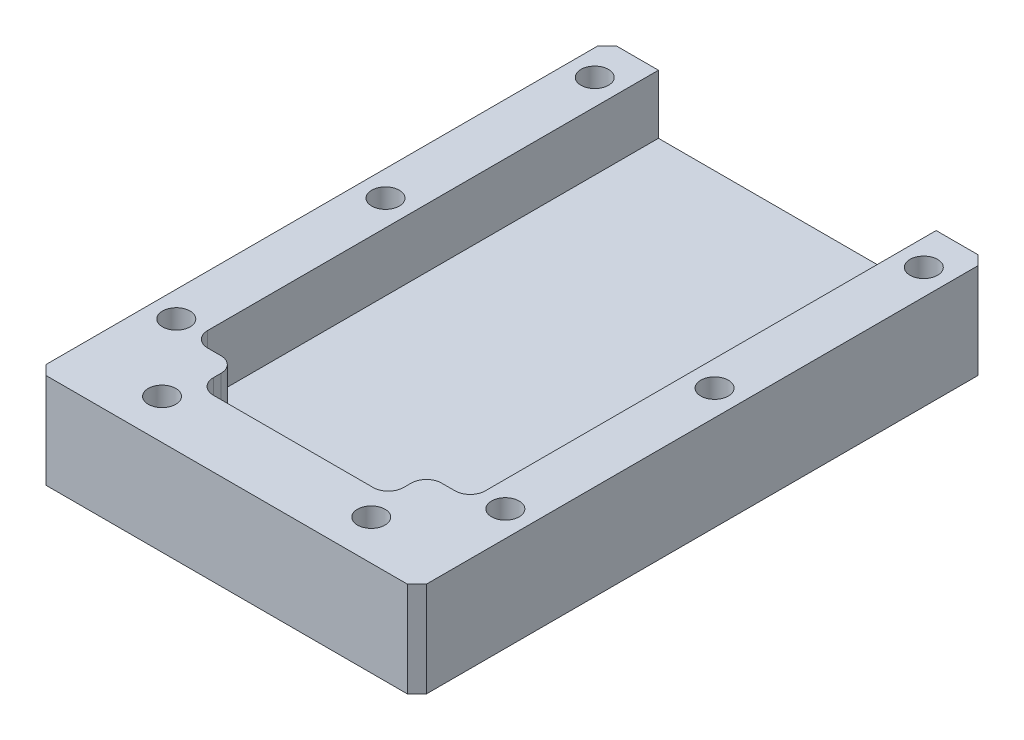
ISO-10303-21;
HEADER;
FILE_DESCRIPTION(('STEP AP214'),'2;1');
FILE_NAME('part.step','',(''),(''),'','','');
FILE_SCHEMA(('AUTOMOTIVE_DESIGN { 1 0 10303 214 1 1 1 1 }'));
ENDSEC;
DATA;
#1=APPLICATION_CONTEXT('core data for automotive mechanical design processes');
#2=APPLICATION_PROTOCOL_DEFINITION('international standard','automotive_design',2000,#1);
#3=PRODUCT_CONTEXT('',#1,'mechanical');
#4=PRODUCT('Part','Part','',(#3));
#5=PRODUCT_RELATED_PRODUCT_CATEGORY('part','',(#4));
#6=PRODUCT_DEFINITION_FORMATION('','',#4);
#7=PRODUCT_DEFINITION_CONTEXT('part definition',#1,'design');
#8=PRODUCT_DEFINITION('design','',#6,#7);
#9=PRODUCT_DEFINITION_SHAPE('','',#8);
#10=(LENGTH_UNIT() NAMED_UNIT(*) SI_UNIT(.MILLI.,.METRE.));
#11=(NAMED_UNIT(*) PLANE_ANGLE_UNIT() SI_UNIT($,.RADIAN.));
#12=(NAMED_UNIT(*) SI_UNIT($,.STERADIAN.) SOLID_ANGLE_UNIT());
#13=UNCERTAINTY_MEASURE_WITH_UNIT(LENGTH_MEASURE(1.E-05),#10,'distance_accuracy_value','');
#14=(GEOMETRIC_REPRESENTATION_CONTEXT(3) GLOBAL_UNCERTAINTY_ASSIGNED_CONTEXT((#13)) GLOBAL_UNIT_ASSIGNED_CONTEXT((#10,
#11,#12)) REPRESENTATION_CONTEXT('',''));
#15=CARTESIAN_POINT('',(0.,0.,0.));
#16=DIRECTION('',(0.,0.,1.));
#17=DIRECTION('',(1.,0.,0.));
#18=AXIS2_PLACEMENT_3D('',#15,#16,#17);
#19=CARTESIAN_POINT('',(-40.,10.,-30.));
#20=DIRECTION('',(1.,0.,0.));
#21=DIRECTION('',(0.,0.,-1.));
#22=AXIS2_PLACEMENT_3D('',#19,#20,#21);
#23=PLANE('',#22);
#24=DIRECTION('',(0.,0.,1.));
#25=VECTOR('',#24,1.);
#26=CARTESIAN_POINT('',(-40.,0.,-30.));
#27=LINE('',#26,#25);
#28=CARTESIAN_POINT('',(-40.,0.,-29.));
#29=VERTEX_POINT('',#28);
#30=CARTESIAN_POINT('',(-40.,0.,29.));
#31=VERTEX_POINT('',#30);
#32=EDGE_CURVE('E338',#29,#31,#27,.T.);
#33=ORIENTED_EDGE('',*,*,#32,.T.);
#34=DIRECTION('',(0.,1.,0.));
#35=VECTOR('',#34,1.);
#36=CARTESIAN_POINT('',(-40.,10.,29.));
#37=LINE('',#36,#35);
#38=CARTESIAN_POINT('',(-40.,10.,29.));
#39=VERTEX_POINT('',#38);
#40=EDGE_CURVE('E11',#31,#39,#37,.T.);
#41=ORIENTED_EDGE('',*,*,#40,.T.);
#42=DIRECTION('',(0.,0.,1.));
#43=VECTOR('',#42,1.);
#44=CARTESIAN_POINT('',(-40.,10.,-30.));
#45=LINE('',#44,#43);
#46=CARTESIAN_POINT('',(-40.,10.,-29.));
#47=VERTEX_POINT('',#46);
#48=EDGE_CURVE('E339',#47,#39,#45,.T.);
#49=ORIENTED_EDGE('',*,*,#48,.F.);
#50=DIRECTION('',(0.,-1.,0.));
#51=VECTOR('',#50,1.);
#52=CARTESIAN_POINT('',(-40.,10.,-29.));
#53=LINE('',#52,#51);
#54=EDGE_CURVE('E59',#47,#29,#53,.T.);
#55=ORIENTED_EDGE('',*,*,#54,.T.);
#56=EDGE_LOOP('',(#33,#41,#49,#55));
#57=FACE_BOUND('',#56,.T.);
#58=ADVANCED_FACE('F49',(#57),#23,.F.);
#59=CARTESIAN_POINT('',(-40.,10.,30.));
#60=DIRECTION('',(0.,0.,-1.));
#61=DIRECTION('',(-1.,0.,0.));
#62=AXIS2_PLACEMENT_3D('',#59,#60,#61);
#63=PLANE('',#62);
#64=DIRECTION('',(1.,0.,0.));
#65=VECTOR('',#64,1.);
#66=CARTESIAN_POINT('',(-40.,0.,30.));
#67=LINE('',#66,#65);
#68=CARTESIAN_POINT('',(-39.,0.,30.));
#69=VERTEX_POINT('',#68);
#70=CARTESIAN_POINT('',(-1.,0.,30.));
#71=VERTEX_POINT('',#70);
#72=EDGE_CURVE('E358',#69,#71,#67,.T.);
#73=ORIENTED_EDGE('',*,*,#72,.T.);
#74=DIRECTION('',(0.,1.,0.));
#75=VECTOR('',#74,1.);
#76=CARTESIAN_POINT('',(-1.,10.,30.));
#77=LINE('',#76,#75);
#78=CARTESIAN_POINT('',(-1.,10.,30.));
#79=VERTEX_POINT('',#78);
#80=EDGE_CURVE('E66',#71,#79,#77,.T.);
#81=ORIENTED_EDGE('',*,*,#80,.T.);
#82=DIRECTION('',(1.,0.,0.));
#83=VECTOR('',#82,1.);
#84=CARTESIAN_POINT('',(-40.,10.,30.));
#85=LINE('',#84,#83);
#86=CARTESIAN_POINT('',(-39.,10.,30.));
#87=VERTEX_POINT('',#86);
#88=EDGE_CURVE('E342',#87,#79,#85,.T.);
#89=ORIENTED_EDGE('',*,*,#88,.F.);
#90=DIRECTION('',(0.,-1.,0.));
#91=VECTOR('',#90,1.);
#92=CARTESIAN_POINT('',(-39.,10.,30.));
#93=LINE('',#92,#91);
#94=EDGE_CURVE('E480',#87,#69,#93,.T.);
#95=ORIENTED_EDGE('',*,*,#94,.T.);
#96=EDGE_LOOP('',(#73,#81,#89,#95));
#97=FACE_BOUND('',#96,.T.);
#98=ADVANCED_FACE('F501',(#97),#63,.F.);
#99=CARTESIAN_POINT('',(0.,10.,-30.));
#100=DIRECTION('',(-1.,0.,0.));
#101=DIRECTION('',(0.,0.,1.));
#102=AXIS2_PLACEMENT_3D('',#99,#100,#101);
#103=PLANE('',#102);
#104=DIRECTION('',(0.,0.,-1.));
#105=VECTOR('',#104,1.);
#106=CARTESIAN_POINT('',(0.,0.,-30.));
#107=LINE('',#106,#105);
#108=CARTESIAN_POINT('',(0.,0.,29.));
#109=VERTEX_POINT('',#108);
#110=CARTESIAN_POINT('',(0.,0.,-29.));
#111=VERTEX_POINT('',#110);
#112=EDGE_CURVE('E361',#109,#111,#107,.T.);
#113=ORIENTED_EDGE('',*,*,#112,.T.);
#114=DIRECTION('',(0.,1.,0.));
#115=VECTOR('',#114,1.);
#116=CARTESIAN_POINT('',(0.,10.,-29.));
#117=LINE('',#116,#115);
#118=CARTESIAN_POINT('',(0.,10.,-29.));
#119=VERTEX_POINT('',#118);
#120=EDGE_CURVE('E466',#111,#119,#117,.T.);
#121=ORIENTED_EDGE('',*,*,#120,.T.);
#122=DIRECTION('',(0.,0.,-1.));
#123=VECTOR('',#122,1.);
#124=CARTESIAN_POINT('',(0.,10.,-30.));
#125=LINE('',#124,#123);
#126=CARTESIAN_POINT('',(0.,10.,29.));
#127=VERTEX_POINT('',#126);
#128=EDGE_CURVE('E346',#127,#119,#125,.T.);
#129=ORIENTED_EDGE('',*,*,#128,.F.);
#130=DIRECTION('',(0.,-1.,0.));
#131=VECTOR('',#130,1.);
#132=CARTESIAN_POINT('',(0.,10.,29.));
#133=LINE('',#132,#131);
#134=EDGE_CURVE('E462',#127,#109,#133,.T.);
#135=ORIENTED_EDGE('',*,*,#134,.T.);
#136=EDGE_LOOP('',(#113,#121,#129,#135));
#137=FACE_BOUND('',#136,.T.);
#138=ADVANCED_FACE('F511',(#137),#103,.F.);
#139=CARTESIAN_POINT('',(-40.,10.,-30.));
#140=DIRECTION('',(0.,0.,1.));
#141=DIRECTION('',(1.,0.,0.));
#142=AXIS2_PLACEMENT_3D('',#139,#140,#141);
#143=PLANE('',#142);
#144=DIRECTION('',(-1.,0.,0.));
#145=VECTOR('',#144,1.);
#146=CARTESIAN_POINT('',(-40.,10.,-30.));
#147=LINE('',#146,#145);
#148=CARTESIAN_POINT('',(-1.,10.,-30.));
#149=VERTEX_POINT('',#148);
#150=CARTESIAN_POINT('',(-5.4,10.,-30.));
#151=VERTEX_POINT('',#150);
#152=EDGE_CURVE('E351',#149,#151,#147,.T.);
#153=ORIENTED_EDGE('',*,*,#152,.F.);
#154=DIRECTION('',(0.,-1.,0.));
#155=VECTOR('',#154,1.);
#156=CARTESIAN_POINT('',(-1.,10.,-30.));
#157=LINE('',#156,#155);
#158=CARTESIAN_POINT('',(-1.,0.,-30.));
#159=VERTEX_POINT('',#158);
#160=EDGE_CURVE('E446',#149,#159,#157,.T.);
#161=ORIENTED_EDGE('',*,*,#160,.T.);
#162=DIRECTION('',(-1.,0.,0.));
#163=VECTOR('',#162,1.);
#164=CARTESIAN_POINT('',(-40.,0.,-30.));
#165=LINE('',#164,#163);
#166=CARTESIAN_POINT('',(-39.,0.,-30.));
#167=VERTEX_POINT('',#166);
#168=EDGE_CURVE('E343',#159,#167,#165,.T.);
#169=ORIENTED_EDGE('',*,*,#168,.T.);
#170=DIRECTION('',(0.,1.,0.));
#171=VECTOR('',#170,1.);
#172=CARTESIAN_POINT('',(-39.,10.,-30.));
#173=LINE('',#172,#171);
#174=CARTESIAN_POINT('',(-39.,10.,-30.));
#175=VERTEX_POINT('',#174);
#176=EDGE_CURVE('E443',#167,#175,#173,.T.);
#177=ORIENTED_EDGE('',*,*,#176,.T.);
#178=CARTESIAN_POINT('',(-34.6,10.,-30.));
#179=VERTEX_POINT('',#178);
#180=EDGE_CURVE('E350',#179,#175,#147,.T.);
#181=ORIENTED_EDGE('',*,*,#180,.F.);
#182=DIRECTION('',(0.,1.,0.));
#183=VECTOR('',#182,1.);
#184=CARTESIAN_POINT('',(-34.6,3.8,-30.));
#185=LINE('',#184,#183);
#186=CARTESIAN_POINT('',(-34.6,3.8,-30.));
#187=VERTEX_POINT('',#186);
#188=EDGE_CURVE('E226',#187,#179,#185,.T.);
#189=ORIENTED_EDGE('',*,*,#188,.F.);
#190=DIRECTION('',(-1.,0.,0.));
#191=VECTOR('',#190,1.);
#192=CARTESIAN_POINT('',(-5.4,3.8,-30.));
#193=LINE('',#192,#191);
#194=CARTESIAN_POINT('',(-5.4,3.8,-30.));
#195=VERTEX_POINT('',#194);
#196=EDGE_CURVE('E206',#195,#187,#193,.T.);
#197=ORIENTED_EDGE('',*,*,#196,.F.);
#198=DIRECTION('',(0.,1.,0.));
#199=VECTOR('',#198,1.);
#200=CARTESIAN_POINT('',(-5.4,3.8,-30.));
#201=LINE('',#200,#199);
#202=EDGE_CURVE('E219',#195,#151,#201,.T.);
#203=ORIENTED_EDGE('',*,*,#202,.T.);
#204=EDGE_LOOP('',(#153,#161,#169,#177,#181,#189,#197,#203));
#205=FACE_BOUND('',#204,.T.);
#206=ADVANCED_FACE('F229',(#205),#143,.F.);
#207=CARTESIAN_POINT('',(0.,10.,0.));
#208=DIRECTION('',(0.,1.,0.));
#209=DIRECTION('',(0.,0.,1.));
#210=AXIS2_PLACEMENT_3D('',#207,#208,#209);
#211=PLANE('',#210);
#212=ORIENTED_EDGE('',*,*,#128,.T.);
#213=DIRECTION('',(0.707106781186543,0.,0.707106781186552));
#214=VECTOR('',#213,1.);
#215=CARTESIAN_POINT('',(14.5,10.,-14.4999999999998));
#216=LINE('',#215,#214);
#217=EDGE_CURVE('E477',#119,#149,#216,.F.);
#218=ORIENTED_EDGE('',*,*,#217,.T.);
#219=ORIENTED_EDGE('',*,*,#152,.T.);
#220=DIRECTION('',(0.,0.,-1.));
#221=VECTOR('',#220,1.);
#222=CARTESIAN_POINT('',(-5.4,10.,19.));
#223=LINE('',#222,#221);
#224=CARTESIAN_POINT('',(-5.4,10.,17.4));
#225=VERTEX_POINT('',#224);
#226=EDGE_CURVE('E222',#225,#151,#223,.T.);
#227=ORIENTED_EDGE('',*,*,#226,.F.);
#228=CARTESIAN_POINT('',(-7.,10.,17.4));
#229=DIRECTION('',(0.,1.,0.));
#230=DIRECTION('',(0.,0.,1.));
#231=AXIS2_PLACEMENT_3D('',#228,#229,#230);
#232=CIRCLE('',#231,1.6);
#233=CARTESIAN_POINT('',(-7.,10.,19.));
#234=VERTEX_POINT('',#233);
#235=EDGE_CURVE('E431',#225,#234,#232,.F.);
#236=ORIENTED_EDGE('',*,*,#235,.T.);
#237=DIRECTION('',(1.,0.,0.));
#238=VECTOR('',#237,1.);
#239=CARTESIAN_POINT('',(-10.,10.,19.));
#240=LINE('',#239,#238);
#241=CARTESIAN_POINT('',(-8.4,10.,19.));
#242=VERTEX_POINT('',#241);
#243=EDGE_CURVE('E253',#242,#234,#240,.T.);
#244=ORIENTED_EDGE('',*,*,#243,.F.);
#245=CARTESIAN_POINT('',(-8.4,10.,20.6));
#246=DIRECTION('',(0.,1.,0.));
#247=DIRECTION('',(0.,0.,1.));
#248=AXIS2_PLACEMENT_3D('',#245,#246,#247);
#249=CIRCLE('',#248,1.6);
#250=CARTESIAN_POINT('',(-10.,10.,20.6));
#251=VERTEX_POINT('',#250);
#252=EDGE_CURVE('E374',#242,#251,#249,.T.);
#253=ORIENTED_EDGE('',*,*,#252,.T.);
#254=DIRECTION('',(0.,0.,-1.));
#255=VECTOR('',#254,1.);
#256=CARTESIAN_POINT('',(-10.,10.,23.));
#257=LINE('',#256,#255);
#258=CARTESIAN_POINT('',(-10.,10.,21.4));
#259=VERTEX_POINT('',#258);
#260=EDGE_CURVE('E249',#259,#251,#257,.T.);
#261=ORIENTED_EDGE('',*,*,#260,.F.);
#262=CARTESIAN_POINT('',(-11.6,10.,21.4));
#263=DIRECTION('',(0.,1.,0.));
#264=DIRECTION('',(0.,0.,1.));
#265=AXIS2_PLACEMENT_3D('',#262,#263,#264);
#266=CIRCLE('',#265,1.6);
#267=CARTESIAN_POINT('',(-11.6,10.,23.));
#268=VERTEX_POINT('',#267);
#269=EDGE_CURVE('E437',#259,#268,#266,.F.);
#270=ORIENTED_EDGE('',*,*,#269,.T.);
#271=DIRECTION('',(1.,0.,0.));
#272=VECTOR('',#271,1.);
#273=CARTESIAN_POINT('',(-30.,10.,23.));
#274=LINE('',#273,#272);
#275=CARTESIAN_POINT('',(-28.4,10.,23.));
#276=VERTEX_POINT('',#275);
#277=EDGE_CURVE('E245',#276,#268,#274,.T.);
#278=ORIENTED_EDGE('',*,*,#277,.F.);
#279=CARTESIAN_POINT('',(-28.4,10.,21.4));
#280=DIRECTION('',(0.,1.,0.));
#281=DIRECTION('',(0.,0.,1.));
#282=AXIS2_PLACEMENT_3D('',#279,#280,#281);
#283=CIRCLE('',#282,1.6);
#284=CARTESIAN_POINT('',(-30.,10.,21.4));
#285=VERTEX_POINT('',#284);
#286=EDGE_CURVE('E440',#276,#285,#283,.F.);
#287=ORIENTED_EDGE('',*,*,#286,.T.);
#288=DIRECTION('',(0.,0.,1.));
#289=VECTOR('',#288,1.);
#290=CARTESIAN_POINT('',(-30.,10.,19.));
#291=LINE('',#290,#289);
#292=CARTESIAN_POINT('',(-30.,10.,20.6));
#293=VERTEX_POINT('',#292);
#294=EDGE_CURVE('E267',#293,#285,#291,.T.);
#295=ORIENTED_EDGE('',*,*,#294,.F.);
#296=CARTESIAN_POINT('',(-31.6,10.,20.6));
#297=DIRECTION('',(0.,1.,0.));
#298=DIRECTION('',(0.,0.,1.));
#299=AXIS2_PLACEMENT_3D('',#296,#297,#298);
#300=CIRCLE('',#299,1.6);
#301=CARTESIAN_POINT('',(-31.6,10.,19.));
#302=VERTEX_POINT('',#301);
#303=EDGE_CURVE('E377',#293,#302,#300,.T.);
#304=ORIENTED_EDGE('',*,*,#303,.T.);
#305=DIRECTION('',(1.,0.,0.));
#306=VECTOR('',#305,1.);
#307=CARTESIAN_POINT('',(-34.6,10.,19.));
#308=LINE('',#307,#306);
#309=CARTESIAN_POINT('',(-33.,10.,19.));
#310=VERTEX_POINT('',#309);
#311=EDGE_CURVE('E263',#310,#302,#308,.T.);
#312=ORIENTED_EDGE('',*,*,#311,.F.);
#313=CARTESIAN_POINT('',(-33.,10.,17.4));
#314=DIRECTION('',(0.,1.,0.));
#315=DIRECTION('',(0.,0.,1.));
#316=AXIS2_PLACEMENT_3D('',#313,#314,#315);
#317=CIRCLE('',#316,1.6);
#318=CARTESIAN_POINT('',(-34.6,10.,17.4));
#319=VERTEX_POINT('',#318);
#320=EDGE_CURVE('E428',#310,#319,#317,.F.);
#321=ORIENTED_EDGE('',*,*,#320,.T.);
#322=DIRECTION('',(0.,0.,1.));
#323=VECTOR('',#322,1.);
#324=CARTESIAN_POINT('',(-34.6,10.,-30.));
#325=LINE('',#324,#323);
#326=EDGE_CURVE('E259',#179,#319,#325,.T.);
#327=ORIENTED_EDGE('',*,*,#326,.F.);
#328=ORIENTED_EDGE('',*,*,#180,.T.);
#329=DIRECTION('',(0.70710678118655,0.,-0.707106781186545));
#330=VECTOR('',#329,1.);
#331=CARTESIAN_POINT('',(-34.4999999999999,10.,-34.5000000000001));
#332=LINE('',#331,#330);
#333=EDGE_CURVE('E469',#175,#47,#332,.F.);
#334=ORIENTED_EDGE('',*,*,#333,.T.);
#335=ORIENTED_EDGE('',*,*,#48,.T.);
#336=DIRECTION('',(-0.707106781186543,0.,-0.707106781186552));
#337=VECTOR('',#336,1.);
#338=CARTESIAN_POINT('',(-34.5000000000003,10.,34.4999999999998));
#339=LINE('',#338,#337);
#340=EDGE_CURVE('E73',#39,#87,#339,.F.);
#341=ORIENTED_EDGE('',*,*,#340,.T.);
#342=ORIENTED_EDGE('',*,*,#88,.T.);
#343=DIRECTION('',(-0.70710678118655,0.,0.707106781186545));
#344=VECTOR('',#343,1.);
#345=CARTESIAN_POINT('',(14.5,10.,14.5000000000001));
#346=LINE('',#345,#344);
#347=EDGE_CURVE('E474',#79,#127,#346,.F.);
#348=ORIENTED_EDGE('',*,*,#347,.T.);
#349=EDGE_LOOP('',(#212,#218,#219,#227,#236,#244,#253,#261,#270,#278,#287,#295,#304,#312,#321,
#327,#328,#334,#335,#341,#342,#348));
#350=FACE_BOUND('',#349,.T.);
#351=CARTESIAN_POINT('',(-37.3,10.,-26.));
#352=DIRECTION('',(0.,1.,0.));
#353=DIRECTION('',(0.,0.,1.));
#354=AXIS2_PLACEMENT_3D('',#351,#352,#353);
#355=CIRCLE('',#354,1.45);
#356=CARTESIAN_POINT('',(-37.3,10.,-24.55));
#357=VERTEX_POINT('',#356);
#358=EDGE_CURVE('E273',#357,#357,#355,.T.);
#359=ORIENTED_EDGE('',*,*,#358,.F.);
#360=EDGE_LOOP('',(#359));
#361=FACE_BOUND('',#360,.T.);
#362=CARTESIAN_POINT('',(-37.3,10.,-4.));
#363=DIRECTION('',(0.,1.,0.));
#364=DIRECTION('',(0.,0.,1.));
#365=AXIS2_PLACEMENT_3D('',#362,#363,#364);
#366=CIRCLE('',#365,1.45);
#367=CARTESIAN_POINT('',(-37.3,10.,-2.55));
#368=VERTEX_POINT('',#367);
#369=EDGE_CURVE('E282',#368,#368,#366,.T.);
#370=ORIENTED_EDGE('',*,*,#369,.F.);
#371=EDGE_LOOP('',(#370));
#372=FACE_BOUND('',#371,.T.);
#373=CARTESIAN_POINT('',(-37.3,10.,18.));
#374=DIRECTION('',(0.,1.,0.));
#375=DIRECTION('',(0.,0.,1.));
#376=AXIS2_PLACEMENT_3D('',#373,#374,#375);
#377=CIRCLE('',#376,1.45);
#378=CARTESIAN_POINT('',(-37.3,10.,19.45));
#379=VERTEX_POINT('',#378);
#380=EDGE_CURVE('E290',#379,#379,#377,.T.);
#381=ORIENTED_EDGE('',*,*,#380,.F.);
#382=EDGE_LOOP('',(#381));
#383=FACE_BOUND('',#382,.T.);
#384=CARTESIAN_POINT('',(-31.,10.,25.8));
#385=DIRECTION('',(0.,1.,0.));
#386=DIRECTION('',(0.,0.,1.));
#387=AXIS2_PLACEMENT_3D('',#384,#385,#386);
#388=CIRCLE('',#387,1.45);
#389=CARTESIAN_POINT('',(-31.,10.,27.25));
#390=VERTEX_POINT('',#389);
#391=EDGE_CURVE('E298',#390,#390,#388,.T.);
#392=ORIENTED_EDGE('',*,*,#391,.F.);
#393=EDGE_LOOP('',(#392));
#394=FACE_BOUND('',#393,.T.);
#395=CARTESIAN_POINT('',(-9.,10.,25.8));
#396=DIRECTION('',(0.,1.,0.));
#397=DIRECTION('',(0.,0.,1.));
#398=AXIS2_PLACEMENT_3D('',#395,#396,#397);
#399=CIRCLE('',#398,1.45);
#400=CARTESIAN_POINT('',(-9.,10.,27.25));
#401=VERTEX_POINT('',#400);
#402=EDGE_CURVE('E306',#401,#401,#399,.T.);
#403=ORIENTED_EDGE('',*,*,#402,.F.);
#404=EDGE_LOOP('',(#403));
#405=FACE_BOUND('',#404,.T.);
#406=CARTESIAN_POINT('',(-2.7,10.,18.));
#407=DIRECTION('',(0.,1.,0.));
#408=DIRECTION('',(0.,0.,1.));
#409=AXIS2_PLACEMENT_3D('',#406,#407,#408);
#410=CIRCLE('',#409,1.45);
#411=CARTESIAN_POINT('',(-2.7,10.,19.45));
#412=VERTEX_POINT('',#411);
#413=EDGE_CURVE('E314',#412,#412,#410,.T.);
#414=ORIENTED_EDGE('',*,*,#413,.F.);
#415=EDGE_LOOP('',(#414));
#416=FACE_BOUND('',#415,.T.);
#417=CARTESIAN_POINT('',(-2.7,10.,-4.));
#418=DIRECTION('',(0.,1.,0.));
#419=DIRECTION('',(0.,0.,1.));
#420=AXIS2_PLACEMENT_3D('',#417,#418,#419);
#421=CIRCLE('',#420,1.45);
#422=CARTESIAN_POINT('',(-2.7,10.,-2.55));
#423=VERTEX_POINT('',#422);
#424=EDGE_CURVE('E322',#423,#423,#421,.T.);
#425=ORIENTED_EDGE('',*,*,#424,.F.);
#426=EDGE_LOOP('',(#425));
#427=FACE_BOUND('',#426,.T.);
#428=CARTESIAN_POINT('',(-2.7,10.,-26.));
#429=DIRECTION('',(0.,1.,0.));
#430=DIRECTION('',(0.,0.,1.));
#431=AXIS2_PLACEMENT_3D('',#428,#429,#430);
#432=CIRCLE('',#431,1.45);
#433=CARTESIAN_POINT('',(-2.7,10.,-24.55));
#434=VERTEX_POINT('',#433);
#435=EDGE_CURVE('E330',#434,#434,#432,.T.);
#436=ORIENTED_EDGE('',*,*,#435,.F.);
#437=EDGE_LOOP('',(#436));
#438=FACE_BOUND('',#437,.T.);
#439=ADVANCED_FACE('F503',(#350,#361,#372,#383,#394,#405,#416,#427,#438),#211,.T.);
#440=CARTESIAN_POINT('',(0.,0.,0.));
#441=DIRECTION('',(0.,1.,0.));
#442=DIRECTION('',(0.,0.,1.));
#443=AXIS2_PLACEMENT_3D('',#440,#441,#442);
#444=PLANE('',#443);
#445=CARTESIAN_POINT('',(-37.3,0.,-26.));
#446=DIRECTION('',(0.,1.,0.));
#447=DIRECTION('',(0.,0.,1.));
#448=AXIS2_PLACEMENT_3D('',#445,#446,#447);
#449=CIRCLE('',#448,1.45);
#450=CARTESIAN_POINT('',(-37.3,0.,-24.55));
#451=VERTEX_POINT('',#450);
#452=EDGE_CURVE('E278',#451,#451,#449,.T.);
#453=ORIENTED_EDGE('',*,*,#452,.T.);
#454=EDGE_LOOP('',(#453));
#455=FACE_BOUND('',#454,.T.);
#456=CARTESIAN_POINT('',(-37.3,0.,-4.));
#457=DIRECTION('',(0.,1.,0.));
#458=DIRECTION('',(0.,0.,1.));
#459=AXIS2_PLACEMENT_3D('',#456,#457,#458);
#460=CIRCLE('',#459,1.45);
#461=CARTESIAN_POINT('',(-37.3,0.,-2.55));
#462=VERTEX_POINT('',#461);
#463=EDGE_CURVE('E286',#462,#462,#460,.T.);
#464=ORIENTED_EDGE('',*,*,#463,.T.);
#465=EDGE_LOOP('',(#464));
#466=FACE_BOUND('',#465,.T.);
#467=CARTESIAN_POINT('',(-37.3,0.,18.));
#468=DIRECTION('',(0.,1.,0.));
#469=DIRECTION('',(0.,0.,1.));
#470=AXIS2_PLACEMENT_3D('',#467,#468,#469);
#471=CIRCLE('',#470,1.45);
#472=CARTESIAN_POINT('',(-37.3,0.,19.45));
#473=VERTEX_POINT('',#472);
#474=EDGE_CURVE('E294',#473,#473,#471,.T.);
#475=ORIENTED_EDGE('',*,*,#474,.T.);
#476=EDGE_LOOP('',(#475));
#477=FACE_BOUND('',#476,.T.);
#478=CARTESIAN_POINT('',(-31.,0.,25.8));
#479=DIRECTION('',(0.,1.,0.));
#480=DIRECTION('',(0.,0.,1.));
#481=AXIS2_PLACEMENT_3D('',#478,#479,#480);
#482=CIRCLE('',#481,1.45);
#483=CARTESIAN_POINT('',(-31.,0.,27.25));
#484=VERTEX_POINT('',#483);
#485=EDGE_CURVE('E302',#484,#484,#482,.T.);
#486=ORIENTED_EDGE('',*,*,#485,.T.);
#487=EDGE_LOOP('',(#486));
#488=FACE_BOUND('',#487,.T.);
#489=CARTESIAN_POINT('',(-9.,0.,25.8));
#490=DIRECTION('',(0.,1.,0.));
#491=DIRECTION('',(0.,0.,1.));
#492=AXIS2_PLACEMENT_3D('',#489,#490,#491);
#493=CIRCLE('',#492,1.45);
#494=CARTESIAN_POINT('',(-9.,0.,27.25));
#495=VERTEX_POINT('',#494);
#496=EDGE_CURVE('E310',#495,#495,#493,.T.);
#497=ORIENTED_EDGE('',*,*,#496,.T.);
#498=EDGE_LOOP('',(#497));
#499=FACE_BOUND('',#498,.T.);
#500=CARTESIAN_POINT('',(-2.7,0.,18.));
#501=DIRECTION('',(0.,1.,0.));
#502=DIRECTION('',(0.,0.,1.));
#503=AXIS2_PLACEMENT_3D('',#500,#501,#502);
#504=CIRCLE('',#503,1.45);
#505=CARTESIAN_POINT('',(-2.7,0.,19.45));
#506=VERTEX_POINT('',#505);
#507=EDGE_CURVE('E318',#506,#506,#504,.T.);
#508=ORIENTED_EDGE('',*,*,#507,.T.);
#509=EDGE_LOOP('',(#508));
#510=FACE_BOUND('',#509,.T.);
#511=CARTESIAN_POINT('',(-2.7,0.,-4.));
#512=DIRECTION('',(0.,1.,0.));
#513=DIRECTION('',(0.,0.,1.));
#514=AXIS2_PLACEMENT_3D('',#511,#512,#513);
#515=CIRCLE('',#514,1.45);
#516=CARTESIAN_POINT('',(-2.7,0.,-2.55));
#517=VERTEX_POINT('',#516);
#518=EDGE_CURVE('E326',#517,#517,#515,.T.);
#519=ORIENTED_EDGE('',*,*,#518,.T.);
#520=EDGE_LOOP('',(#519));
#521=FACE_BOUND('',#520,.T.);
#522=CARTESIAN_POINT('',(-2.7,0.,-26.));
#523=DIRECTION('',(0.,1.,0.));
#524=DIRECTION('',(0.,0.,1.));
#525=AXIS2_PLACEMENT_3D('',#522,#523,#524);
#526=CIRCLE('',#525,1.45);
#527=CARTESIAN_POINT('',(-2.7,0.,-24.55));
#528=VERTEX_POINT('',#527);
#529=EDGE_CURVE('E334',#528,#528,#526,.T.);
#530=ORIENTED_EDGE('',*,*,#529,.T.);
#531=EDGE_LOOP('',(#530));
#532=FACE_BOUND('',#531,.T.);
#533=ORIENTED_EDGE('',*,*,#168,.F.);
#534=DIRECTION('',(-0.707106781186543,0.,-0.707106781186552));
#535=VECTOR('',#534,1.);
#536=CARTESIAN_POINT('',(-1.,0.,-30.));
#537=LINE('',#536,#535);
#538=EDGE_CURVE('E459',#159,#111,#537,.F.);
#539=ORIENTED_EDGE('',*,*,#538,.T.);
#540=ORIENTED_EDGE('',*,*,#112,.F.);
#541=DIRECTION('',(0.70710678118655,0.,-0.707106781186545));
#542=VECTOR('',#541,1.);
#543=CARTESIAN_POINT('',(0.,0.,29.));
#544=LINE('',#543,#542);
#545=EDGE_CURVE('E456',#109,#71,#544,.F.);
#546=ORIENTED_EDGE('',*,*,#545,.T.);
#547=ORIENTED_EDGE('',*,*,#72,.F.);
#548=DIRECTION('',(0.707106781186543,0.,0.707106781186552));
#549=VECTOR('',#548,1.);
#550=CARTESIAN_POINT('',(-39.,0.,30.));
#551=LINE('',#550,#549);
#552=EDGE_CURVE('E453',#69,#31,#551,.F.);
#553=ORIENTED_EDGE('',*,*,#552,.T.);
#554=ORIENTED_EDGE('',*,*,#32,.F.);
#555=DIRECTION('',(-0.70710678118655,0.,0.707106781186545));
#556=VECTOR('',#555,1.);
#557=CARTESIAN_POINT('',(-40.,0.,-29.));
#558=LINE('',#557,#556);
#559=EDGE_CURVE('E450',#29,#167,#558,.F.);
#560=ORIENTED_EDGE('',*,*,#559,.T.);
#561=EDGE_LOOP('',(#533,#539,#540,#546,#547,#553,#554,#560));
#562=FACE_BOUND('',#561,.T.);
#563=ADVANCED_FACE('F496',(#455,#466,#477,#488,#499,#510,#521,#532,#562),#444,.F.);
#564=CARTESIAN_POINT('',(-2.7,10.,-26.));
#565=DIRECTION('',(0.,1.,0.));
#566=DIRECTION('',(0.,0.,1.));
#567=AXIS2_PLACEMENT_3D('',#564,#565,#566);
#568=CYLINDRICAL_SURFACE('',#567,1.45);
#569=ORIENTED_EDGE('',*,*,#529,.F.);
#570=EDGE_LOOP('',(#569));
#571=FACE_BOUND('',#570,.T.);
#572=ORIENTED_EDGE('',*,*,#435,.T.);
#573=EDGE_LOOP('',(#572));
#574=FACE_BOUND('',#573,.T.);
#575=ADVANCED_FACE('F644',(#571,#574),#568,.F.);
#576=CARTESIAN_POINT('',(-2.7,10.,-4.));
#577=DIRECTION('',(0.,1.,0.));
#578=DIRECTION('',(0.,0.,1.));
#579=AXIS2_PLACEMENT_3D('',#576,#577,#578);
#580=CYLINDRICAL_SURFACE('',#579,1.45);
#581=ORIENTED_EDGE('',*,*,#518,.F.);
#582=EDGE_LOOP('',(#581));
#583=FACE_BOUND('',#582,.T.);
#584=ORIENTED_EDGE('',*,*,#424,.T.);
#585=EDGE_LOOP('',(#584));
#586=FACE_BOUND('',#585,.T.);
#587=ADVANCED_FACE('F640',(#583,#586),#580,.F.);
#588=CARTESIAN_POINT('',(-2.7,10.,18.));
#589=DIRECTION('',(0.,1.,0.));
#590=DIRECTION('',(0.,0.,1.));
#591=AXIS2_PLACEMENT_3D('',#588,#589,#590);
#592=CYLINDRICAL_SURFACE('',#591,1.45);
#593=ORIENTED_EDGE('',*,*,#507,.F.);
#594=EDGE_LOOP('',(#593));
#595=FACE_BOUND('',#594,.T.);
#596=ORIENTED_EDGE('',*,*,#413,.T.);
#597=EDGE_LOOP('',(#596));
#598=FACE_BOUND('',#597,.T.);
#599=ADVANCED_FACE('F636',(#595,#598),#592,.F.);
#600=CARTESIAN_POINT('',(-9.,10.,25.8));
#601=DIRECTION('',(0.,1.,0.));
#602=DIRECTION('',(0.,0.,1.));
#603=AXIS2_PLACEMENT_3D('',#600,#601,#602);
#604=CYLINDRICAL_SURFACE('',#603,1.45);
#605=ORIENTED_EDGE('',*,*,#496,.F.);
#606=EDGE_LOOP('',(#605));
#607=FACE_BOUND('',#606,.T.);
#608=ORIENTED_EDGE('',*,*,#402,.T.);
#609=EDGE_LOOP('',(#608));
#610=FACE_BOUND('',#609,.T.);
#611=ADVANCED_FACE('F632',(#607,#610),#604,.F.);
#612=CARTESIAN_POINT('',(-31.,10.,25.8));
#613=DIRECTION('',(0.,1.,0.));
#614=DIRECTION('',(0.,0.,1.));
#615=AXIS2_PLACEMENT_3D('',#612,#613,#614);
#616=CYLINDRICAL_SURFACE('',#615,1.45);
#617=ORIENTED_EDGE('',*,*,#485,.F.);
#618=EDGE_LOOP('',(#617));
#619=FACE_BOUND('',#618,.T.);
#620=ORIENTED_EDGE('',*,*,#391,.T.);
#621=EDGE_LOOP('',(#620));
#622=FACE_BOUND('',#621,.T.);
#623=ADVANCED_FACE('F628',(#619,#622),#616,.F.);
#624=CARTESIAN_POINT('',(-37.3,10.,18.));
#625=DIRECTION('',(0.,1.,0.));
#626=DIRECTION('',(0.,0.,1.));
#627=AXIS2_PLACEMENT_3D('',#624,#625,#626);
#628=CYLINDRICAL_SURFACE('',#627,1.45);
#629=ORIENTED_EDGE('',*,*,#474,.F.);
#630=EDGE_LOOP('',(#629));
#631=FACE_BOUND('',#630,.T.);
#632=ORIENTED_EDGE('',*,*,#380,.T.);
#633=EDGE_LOOP('',(#632));
#634=FACE_BOUND('',#633,.T.);
#635=ADVANCED_FACE('F624',(#631,#634),#628,.F.);
#636=CARTESIAN_POINT('',(-37.3,10.,-4.));
#637=DIRECTION('',(0.,1.,0.));
#638=DIRECTION('',(0.,0.,1.));
#639=AXIS2_PLACEMENT_3D('',#636,#637,#638);
#640=CYLINDRICAL_SURFACE('',#639,1.45);
#641=ORIENTED_EDGE('',*,*,#463,.F.);
#642=EDGE_LOOP('',(#641));
#643=FACE_BOUND('',#642,.T.);
#644=ORIENTED_EDGE('',*,*,#369,.T.);
#645=EDGE_LOOP('',(#644));
#646=FACE_BOUND('',#645,.T.);
#647=ADVANCED_FACE('F620',(#643,#646),#640,.F.);
#648=CARTESIAN_POINT('',(-37.3,10.,-26.));
#649=DIRECTION('',(0.,1.,0.));
#650=DIRECTION('',(0.,0.,1.));
#651=AXIS2_PLACEMENT_3D('',#648,#649,#650);
#652=CYLINDRICAL_SURFACE('',#651,1.45);
#653=ORIENTED_EDGE('',*,*,#452,.F.);
#654=EDGE_LOOP('',(#653));
#655=FACE_BOUND('',#654,.T.);
#656=ORIENTED_EDGE('',*,*,#358,.T.);
#657=EDGE_LOOP('',(#656));
#658=FACE_BOUND('',#657,.T.);
#659=ADVANCED_FACE('F617',(#655,#658),#652,.F.);
#660=CARTESIAN_POINT('',(-30.,3.8,23.));
#661=DIRECTION('',(0.,0.,1.));
#662=DIRECTION('',(1.,0.,0.));
#663=AXIS2_PLACEMENT_3D('',#660,#661,#662);
#664=PLANE('',#663);
#665=ORIENTED_EDGE('',*,*,#277,.T.);
#666=DIRECTION('',(0.,1.,0.));
#667=VECTOR('',#666,1.);
#668=CARTESIAN_POINT('',(-11.6,3.8,23.));
#669=LINE('',#668,#667);
#670=CARTESIAN_POINT('',(-11.6,3.8,23.));
#671=VERTEX_POINT('',#670);
#672=EDGE_CURVE('E422',#268,#671,#669,.F.);
#673=ORIENTED_EDGE('',*,*,#672,.T.);
#674=DIRECTION('',(1.,0.,0.));
#675=VECTOR('',#674,1.);
#676=CARTESIAN_POINT('',(-30.,3.8,23.));
#677=LINE('',#676,#675);
#678=CARTESIAN_POINT('',(-28.4,3.8,23.));
#679=VERTEX_POINT('',#678);
#680=EDGE_CURVE('E271',#679,#671,#677,.T.);
#681=ORIENTED_EDGE('',*,*,#680,.F.);
#682=DIRECTION('',(0.,1.,0.));
#683=VECTOR('',#682,1.);
#684=CARTESIAN_POINT('',(-28.4,10.,23.));
#685=LINE('',#684,#683);
#686=EDGE_CURVE('E418',#679,#276,#685,.T.);
#687=ORIENTED_EDGE('',*,*,#686,.T.);
#688=EDGE_LOOP('',(#665,#673,#681,#687));
#689=FACE_BOUND('',#688,.T.);
#690=ADVANCED_FACE('F574',(#689),#664,.F.);
#691=CARTESIAN_POINT('',(-30.,3.8,19.));
#692=DIRECTION('',(-1.,0.,0.));
#693=DIRECTION('',(0.,0.,1.));
#694=AXIS2_PLACEMENT_3D('',#691,#692,#693);
#695=PLANE('',#694);
#696=DIRECTION('',(0.,0.,1.));
#697=VECTOR('',#696,1.);
#698=CARTESIAN_POINT('',(-30.,3.8,19.));
#699=LINE('',#698,#697);
#700=CARTESIAN_POINT('',(-30.,3.8,20.6));
#701=VERTEX_POINT('',#700);
#702=CARTESIAN_POINT('',(-30.,3.8,21.4));
#703=VERTEX_POINT('',#702);
#704=EDGE_CURVE('E227',#701,#703,#699,.T.);
#705=ORIENTED_EDGE('',*,*,#704,.F.);
#706=DIRECTION('',(0.,1.,0.));
#707=VECTOR('',#706,1.);
#708=CARTESIAN_POINT('',(-30.,3.8,20.6));
#709=LINE('',#708,#707);
#710=EDGE_CURVE('E370',#701,#293,#709,.T.);
#711=ORIENTED_EDGE('',*,*,#710,.T.);
#712=ORIENTED_EDGE('',*,*,#294,.T.);
#713=DIRECTION('',(0.,1.,0.));
#714=VECTOR('',#713,1.);
#715=CARTESIAN_POINT('',(-30.,3.8,21.4));
#716=LINE('',#715,#714);
#717=EDGE_CURVE('E354',#285,#703,#716,.F.);
#718=ORIENTED_EDGE('',*,*,#717,.T.);
#719=EDGE_LOOP('',(#705,#711,#712,#718));
#720=FACE_BOUND('',#719,.T.);
#721=ADVANCED_FACE('F564',(#720),#695,.F.);
#722=CARTESIAN_POINT('',(-34.6,3.8,19.));
#723=DIRECTION('',(0.,0.,1.));
#724=DIRECTION('',(1.,0.,0.));
#725=AXIS2_PLACEMENT_3D('',#722,#723,#724);
#726=PLANE('',#725);
#727=ORIENTED_EDGE('',*,*,#311,.T.);
#728=DIRECTION('',(0.,1.,0.));
#729=VECTOR('',#728,1.);
#730=CARTESIAN_POINT('',(-31.6,3.8,19.));
#731=LINE('',#730,#729);
#732=CARTESIAN_POINT('',(-31.6,3.8,19.));
#733=VERTEX_POINT('',#732);
#734=EDGE_CURVE('E384',#302,#733,#731,.F.);
#735=ORIENTED_EDGE('',*,*,#734,.T.);
#736=DIRECTION('',(1.,0.,0.));
#737=VECTOR('',#736,1.);
#738=CARTESIAN_POINT('',(-34.6,3.8,19.));
#739=LINE('',#738,#737);
#740=CARTESIAN_POINT('',(-33.,3.8,19.));
#741=VERTEX_POINT('',#740);
#742=EDGE_CURVE('E235',#741,#733,#739,.T.);
#743=ORIENTED_EDGE('',*,*,#742,.F.);
#744=DIRECTION('',(0.,1.,0.));
#745=VECTOR('',#744,1.);
#746=CARTESIAN_POINT('',(-33.,10.,19.));
#747=LINE('',#746,#745);
#748=EDGE_CURVE('E380',#741,#310,#747,.T.);
#749=ORIENTED_EDGE('',*,*,#748,.T.);
#750=EDGE_LOOP('',(#727,#735,#743,#749));
#751=FACE_BOUND('',#750,.T.);
#752=ADVANCED_FACE('F593',(#751),#726,.F.);
#753=CARTESIAN_POINT('',(-34.6,3.8,-30.));
#754=DIRECTION('',(-1.,0.,0.));
#755=DIRECTION('',(0.,0.,1.));
#756=AXIS2_PLACEMENT_3D('',#753,#754,#755);
#757=PLANE('',#756);
#758=ORIENTED_EDGE('',*,*,#326,.T.);
#759=DIRECTION('',(0.,1.,0.));
#760=VECTOR('',#759,1.);
#761=CARTESIAN_POINT('',(-34.6,3.8,17.4));
#762=LINE('',#761,#760);
#763=CARTESIAN_POINT('',(-34.6,3.8,17.4));
#764=VERTEX_POINT('',#763);
#765=EDGE_CURVE('E387',#319,#764,#762,.F.);
#766=ORIENTED_EDGE('',*,*,#765,.T.);
#767=DIRECTION('',(0.,0.,1.));
#768=VECTOR('',#767,1.);
#769=CARTESIAN_POINT('',(-34.6,3.8,-30.));
#770=LINE('',#769,#768);
#771=EDGE_CURVE('E232',#187,#764,#770,.T.);
#772=ORIENTED_EDGE('',*,*,#771,.F.);
#773=ORIENTED_EDGE('',*,*,#188,.T.);
#774=EDGE_LOOP('',(#758,#766,#772,#773));
#775=FACE_BOUND('',#774,.T.);
#776=ADVANCED_FACE('F600',(#775),#757,.F.);
#777=CARTESIAN_POINT('',(-5.4,3.8,19.));
#778=DIRECTION('',(1.,0.,0.));
#779=DIRECTION('',(0.,0.,-1.));
#780=AXIS2_PLACEMENT_3D('',#777,#778,#779);
#781=PLANE('',#780);
#782=DIRECTION('',(0.,0.,-1.));
#783=VECTOR('',#782,1.);
#784=CARTESIAN_POINT('',(-5.4,3.8,19.));
#785=LINE('',#784,#783);
#786=CARTESIAN_POINT('',(-5.4,3.8,17.4));
#787=VERTEX_POINT('',#786);
#788=EDGE_CURVE('E201',#787,#195,#785,.T.);
#789=ORIENTED_EDGE('',*,*,#788,.F.);
#790=DIRECTION('',(0.,1.,0.));
#791=VECTOR('',#790,1.);
#792=CARTESIAN_POINT('',(-5.4,10.,17.4));
#793=LINE('',#792,#791);
#794=EDGE_CURVE('E401',#787,#225,#793,.T.);
#795=ORIENTED_EDGE('',*,*,#794,.T.);
#796=ORIENTED_EDGE('',*,*,#226,.T.);
#797=ORIENTED_EDGE('',*,*,#202,.F.);
#798=EDGE_LOOP('',(#789,#795,#796,#797));
#799=FACE_BOUND('',#798,.T.);
#800=ADVANCED_FACE('F220',(#799),#781,.F.);
#801=CARTESIAN_POINT('',(-10.,3.8,19.));
#802=DIRECTION('',(0.,0.,1.));
#803=DIRECTION('',(1.,0.,0.));
#804=AXIS2_PLACEMENT_3D('',#801,#802,#803);
#805=PLANE('',#804);
#806=ORIENTED_EDGE('',*,*,#243,.T.);
#807=DIRECTION('',(0.,1.,0.));
#808=VECTOR('',#807,1.);
#809=CARTESIAN_POINT('',(-7.,3.8,19.));
#810=LINE('',#809,#808);
#811=CARTESIAN_POINT('',(-7.,3.8,19.));
#812=VERTEX_POINT('',#811);
#813=EDGE_CURVE('E408',#234,#812,#810,.F.);
#814=ORIENTED_EDGE('',*,*,#813,.T.);
#815=DIRECTION('',(1.,0.,0.));
#816=VECTOR('',#815,1.);
#817=CARTESIAN_POINT('',(-10.,3.8,19.));
#818=LINE('',#817,#816);
#819=CARTESIAN_POINT('',(-8.4,3.8,19.));
#820=VERTEX_POINT('',#819);
#821=EDGE_CURVE('E215',#820,#812,#818,.T.);
#822=ORIENTED_EDGE('',*,*,#821,.F.);
#823=DIRECTION('',(0.,1.,0.));
#824=VECTOR('',#823,1.);
#825=CARTESIAN_POINT('',(-8.4,3.8,19.));
#826=LINE('',#825,#824);
#827=EDGE_CURVE('E404',#820,#242,#826,.T.);
#828=ORIENTED_EDGE('',*,*,#827,.T.);
#829=EDGE_LOOP('',(#806,#814,#822,#828));
#830=FACE_BOUND('',#829,.T.);
#831=ADVANCED_FACE('F522',(#830),#805,.F.);
#832=CARTESIAN_POINT('',(-10.,3.8,23.));
#833=DIRECTION('',(1.,0.,0.));
#834=DIRECTION('',(0.,0.,-1.));
#835=AXIS2_PLACEMENT_3D('',#832,#833,#834);
#836=PLANE('',#835);
#837=ORIENTED_EDGE('',*,*,#260,.T.);
#838=DIRECTION('',(0.,1.,0.));
#839=VECTOR('',#838,1.);
#840=CARTESIAN_POINT('',(-10.,3.8,20.6));
#841=LINE('',#840,#839);
#842=CARTESIAN_POINT('',(-10.,3.8,20.6));
#843=VERTEX_POINT('',#842);
#844=EDGE_CURVE('E415',#251,#843,#841,.F.);
#845=ORIENTED_EDGE('',*,*,#844,.T.);
#846=DIRECTION('',(0.,0.,-1.));
#847=VECTOR('',#846,1.);
#848=CARTESIAN_POINT('',(-10.,3.8,23.));
#849=LINE('',#848,#847);
#850=CARTESIAN_POINT('',(-10.,3.8,21.4));
#851=VERTEX_POINT('',#850);
#852=EDGE_CURVE('E578',#851,#843,#849,.T.);
#853=ORIENTED_EDGE('',*,*,#852,.F.);
#854=DIRECTION('',(0.,1.,0.));
#855=VECTOR('',#854,1.);
#856=CARTESIAN_POINT('',(-10.,10.,21.4));
#857=LINE('',#856,#855);
#858=EDGE_CURVE('E411',#851,#259,#857,.T.);
#859=ORIENTED_EDGE('',*,*,#858,.T.);
#860=EDGE_LOOP('',(#837,#845,#853,#859));
#861=FACE_BOUND('',#860,.T.);
#862=ADVANCED_FACE('F555',(#861),#836,.F.);
#863=CARTESIAN_POINT('',(0.,3.8,0.));
#864=DIRECTION('',(0.,1.,0.));
#865=DIRECTION('',(0.,0.,1.));
#866=AXIS2_PLACEMENT_3D('',#863,#864,#865);
#867=PLANE('',#866);
#868=ORIENTED_EDGE('',*,*,#771,.T.);
#869=CARTESIAN_POINT('',(-33.,3.8,17.4));
#870=DIRECTION('',(0.,1.,0.));
#871=DIRECTION('',(0.,0.,1.));
#872=AXIS2_PLACEMENT_3D('',#869,#870,#871);
#873=CIRCLE('',#872,1.6);
#874=EDGE_CURVE('E398',#764,#741,#873,.T.);
#875=ORIENTED_EDGE('',*,*,#874,.T.);
#876=ORIENTED_EDGE('',*,*,#742,.T.);
#877=CARTESIAN_POINT('',(-31.6,3.8,20.6));
#878=DIRECTION('',(0.,1.,0.));
#879=DIRECTION('',(0.,0.,1.));
#880=AXIS2_PLACEMENT_3D('',#877,#878,#879);
#881=CIRCLE('',#880,1.6);
#882=EDGE_CURVE('E425',#733,#701,#881,.F.);
#883=ORIENTED_EDGE('',*,*,#882,.T.);
#884=ORIENTED_EDGE('',*,*,#704,.T.);
#885=CARTESIAN_POINT('',(-28.4,3.8,21.4));
#886=DIRECTION('',(0.,1.,0.));
#887=DIRECTION('',(0.,0.,1.));
#888=AXIS2_PLACEMENT_3D('',#885,#886,#887);
#889=CIRCLE('',#888,1.6);
#890=EDGE_CURVE('E390',#703,#679,#889,.T.);
#891=ORIENTED_EDGE('',*,*,#890,.T.);
#892=ORIENTED_EDGE('',*,*,#680,.T.);
#893=CARTESIAN_POINT('',(-11.6,3.8,21.4));
#894=DIRECTION('',(0.,1.,0.));
#895=DIRECTION('',(0.,0.,1.));
#896=AXIS2_PLACEMENT_3D('',#893,#894,#895);
#897=CIRCLE('',#896,1.6);
#898=EDGE_CURVE('E393',#671,#851,#897,.T.);
#899=ORIENTED_EDGE('',*,*,#898,.T.);
#900=ORIENTED_EDGE('',*,*,#852,.T.);
#901=CARTESIAN_POINT('',(-8.4,3.8,20.6));
#902=DIRECTION('',(0.,1.,0.));
#903=DIRECTION('',(0.,0.,1.));
#904=AXIS2_PLACEMENT_3D('',#901,#902,#903);
#905=CIRCLE('',#904,1.6);
#906=EDGE_CURVE('E434',#843,#820,#905,.F.);
#907=ORIENTED_EDGE('',*,*,#906,.T.);
#908=ORIENTED_EDGE('',*,*,#821,.T.);
#909=CARTESIAN_POINT('',(-7.,3.8,17.4));
#910=DIRECTION('',(0.,1.,0.));
#911=DIRECTION('',(0.,0.,1.));
#912=AXIS2_PLACEMENT_3D('',#909,#910,#911);
#913=CIRCLE('',#912,1.6);
#914=EDGE_CURVE('E210',#812,#787,#913,.T.);
#915=ORIENTED_EDGE('',*,*,#914,.T.);
#916=ORIENTED_EDGE('',*,*,#788,.T.);
#917=ORIENTED_EDGE('',*,*,#196,.T.);
#918=EDGE_LOOP('',(#868,#875,#876,#883,#884,#891,#892,#899,#900,#907,#908,#915,#916,#917));
#919=FACE_BOUND('',#918,.T.);
#920=ADVANCED_FACE('F204',(#919),#867,.T.);
#921=CARTESIAN_POINT('',(-31.6,3.8,20.6));
#922=DIRECTION('',(0.,1.,0.));
#923=DIRECTION('',(0.,0.,1.));
#924=AXIS2_PLACEMENT_3D('',#921,#922,#923);
#925=CYLINDRICAL_SURFACE('',#924,1.6);
#926=ORIENTED_EDGE('',*,*,#882,.F.);
#927=ORIENTED_EDGE('',*,*,#734,.F.);
#928=ORIENTED_EDGE('',*,*,#303,.F.);
#929=ORIENTED_EDGE('',*,*,#710,.F.);
#930=EDGE_LOOP('',(#926,#927,#928,#929));
#931=FACE_BOUND('',#930,.T.);
#932=ADVANCED_FACE('F537',(#931),#925,.T.);
#933=CARTESIAN_POINT('',(-33.,3.8,17.4));
#934=DIRECTION('',(0.,-1.,0.));
#935=DIRECTION('',(0.,0.,-1.));
#936=AXIS2_PLACEMENT_3D('',#933,#934,#935);
#937=CYLINDRICAL_SURFACE('',#936,1.6);
#938=ORIENTED_EDGE('',*,*,#874,.F.);
#939=ORIENTED_EDGE('',*,*,#765,.F.);
#940=ORIENTED_EDGE('',*,*,#320,.F.);
#941=ORIENTED_EDGE('',*,*,#748,.F.);
#942=EDGE_LOOP('',(#938,#939,#940,#941));
#943=FACE_BOUND('',#942,.T.);
#944=ADVANCED_FACE('F528',(#943),#937,.F.);
#945=CARTESIAN_POINT('',(-7.,3.8,17.4));
#946=DIRECTION('',(0.,-1.,0.));
#947=DIRECTION('',(0.,0.,-1.));
#948=AXIS2_PLACEMENT_3D('',#945,#946,#947);
#949=CYLINDRICAL_SURFACE('',#948,1.6);
#950=ORIENTED_EDGE('',*,*,#914,.F.);
#951=ORIENTED_EDGE('',*,*,#813,.F.);
#952=ORIENTED_EDGE('',*,*,#235,.F.);
#953=ORIENTED_EDGE('',*,*,#794,.F.);
#954=EDGE_LOOP('',(#950,#951,#952,#953));
#955=FACE_BOUND('',#954,.T.);
#956=ADVANCED_FACE('F525',(#955),#949,.F.);
#957=CARTESIAN_POINT('',(-8.4,3.8,20.6));
#958=DIRECTION('',(0.,1.,0.));
#959=DIRECTION('',(0.,0.,1.));
#960=AXIS2_PLACEMENT_3D('',#957,#958,#959);
#961=CYLINDRICAL_SURFACE('',#960,1.6);
#962=ORIENTED_EDGE('',*,*,#906,.F.);
#963=ORIENTED_EDGE('',*,*,#844,.F.);
#964=ORIENTED_EDGE('',*,*,#252,.F.);
#965=ORIENTED_EDGE('',*,*,#827,.F.);
#966=EDGE_LOOP('',(#962,#963,#964,#965));
#967=FACE_BOUND('',#966,.T.);
#968=ADVANCED_FACE('F527',(#967),#961,.T.);
#969=CARTESIAN_POINT('',(-11.6,3.8,21.4));
#970=DIRECTION('',(0.,-1.,0.));
#971=DIRECTION('',(0.,0.,-1.));
#972=AXIS2_PLACEMENT_3D('',#969,#970,#971);
#973=CYLINDRICAL_SURFACE('',#972,1.6);
#974=ORIENTED_EDGE('',*,*,#898,.F.);
#975=ORIENTED_EDGE('',*,*,#672,.F.);
#976=ORIENTED_EDGE('',*,*,#269,.F.);
#977=ORIENTED_EDGE('',*,*,#858,.F.);
#978=EDGE_LOOP('',(#974,#975,#976,#977));
#979=FACE_BOUND('',#978,.T.);
#980=ADVANCED_FACE('F534',(#979),#973,.F.);
#981=CARTESIAN_POINT('',(-28.4,3.8,21.4));
#982=DIRECTION('',(0.,-1.,0.));
#983=DIRECTION('',(0.,0.,-1.));
#984=AXIS2_PLACEMENT_3D('',#981,#982,#983);
#985=CYLINDRICAL_SURFACE('',#984,1.6);
#986=ORIENTED_EDGE('',*,*,#890,.F.);
#987=ORIENTED_EDGE('',*,*,#717,.F.);
#988=ORIENTED_EDGE('',*,*,#286,.F.);
#989=ORIENTED_EDGE('',*,*,#686,.F.);
#990=EDGE_LOOP('',(#986,#987,#988,#989));
#991=FACE_BOUND('',#990,.T.);
#992=ADVANCED_FACE('F568',(#991),#985,.F.);
#993=CARTESIAN_POINT('',(-1.,10.,-30.));
#994=DIRECTION('',(-0.707106781186552,0.,0.707106781186542));
#995=DIRECTION('',(0.,-1.,0.));
#996=AXIS2_PLACEMENT_3D('',#993,#994,#995);
#997=PLANE('',#996);
#998=ORIENTED_EDGE('',*,*,#217,.F.);
#999=ORIENTED_EDGE('',*,*,#120,.F.);
#1000=ORIENTED_EDGE('',*,*,#538,.F.);
#1001=ORIENTED_EDGE('',*,*,#160,.F.);
#1002=EDGE_LOOP('',(#998,#999,#1000,#1001));
#1003=FACE_BOUND('',#1002,.T.);
#1004=ADVANCED_FACE('F516',(#1003),#997,.F.);
#1005=CARTESIAN_POINT('',(0.,10.,29.));
#1006=DIRECTION('',(-0.707106781186545,0.,-0.70710678118655));
#1007=DIRECTION('',(0.,-1.,0.));
#1008=AXIS2_PLACEMENT_3D('',#1005,#1006,#1007);
#1009=PLANE('',#1008);
#1010=ORIENTED_EDGE('',*,*,#347,.F.);
#1011=ORIENTED_EDGE('',*,*,#80,.F.);
#1012=ORIENTED_EDGE('',*,*,#545,.F.);
#1013=ORIENTED_EDGE('',*,*,#134,.F.);
#1014=EDGE_LOOP('',(#1010,#1011,#1012,#1013));
#1015=FACE_BOUND('',#1014,.T.);
#1016=ADVANCED_FACE('F508',(#1015),#1009,.F.);
#1017=CARTESIAN_POINT('',(-39.,10.,30.));
#1018=DIRECTION('',(0.707106781186552,0.,-0.707106781186542));
#1019=DIRECTION('',(0.,-1.,0.));
#1020=AXIS2_PLACEMENT_3D('',#1017,#1018,#1019);
#1021=PLANE('',#1020);
#1022=ORIENTED_EDGE('',*,*,#340,.F.);
#1023=ORIENTED_EDGE('',*,*,#40,.F.);
#1024=ORIENTED_EDGE('',*,*,#552,.F.);
#1025=ORIENTED_EDGE('',*,*,#94,.F.);
#1026=EDGE_LOOP('',(#1022,#1023,#1024,#1025));
#1027=FACE_BOUND('',#1026,.T.);
#1028=ADVANCED_FACE('F500',(#1027),#1021,.F.);
#1029=CARTESIAN_POINT('',(-40.,10.,-29.));
#1030=DIRECTION('',(0.707106781186545,0.,0.70710678118655));
#1031=DIRECTION('',(0.,-1.,0.));
#1032=AXIS2_PLACEMENT_3D('',#1029,#1030,#1031);
#1033=PLANE('',#1032);
#1034=ORIENTED_EDGE('',*,*,#333,.F.);
#1035=ORIENTED_EDGE('',*,*,#176,.F.);
#1036=ORIENTED_EDGE('',*,*,#559,.F.);
#1037=ORIENTED_EDGE('',*,*,#54,.F.);
#1038=EDGE_LOOP('',(#1034,#1035,#1036,#1037));
#1039=FACE_BOUND('',#1038,.T.);
#1040=ADVANCED_FACE('F52',(#1039),#1033,.F.);
#1041=CLOSED_SHELL('',(#58,#98,#138,#206,#439,#563,#575,#587,#599,#611,#623,#635,#647,#659,#690,
#721,#752,#776,#800,#831,#862,#920,#932,#944,#956,#968,#980,#992,#1004,#1016,#1028,#1040));
#1042=MANIFOLD_SOLID_BREP('B2',#1041);
#1043=ADVANCED_BREP_SHAPE_REPRESENTATION('',(#18,#1042),#14);
#1044=SHAPE_DEFINITION_REPRESENTATION(#9,#1043);
ENDSEC;
END-ISO-10303-21;
